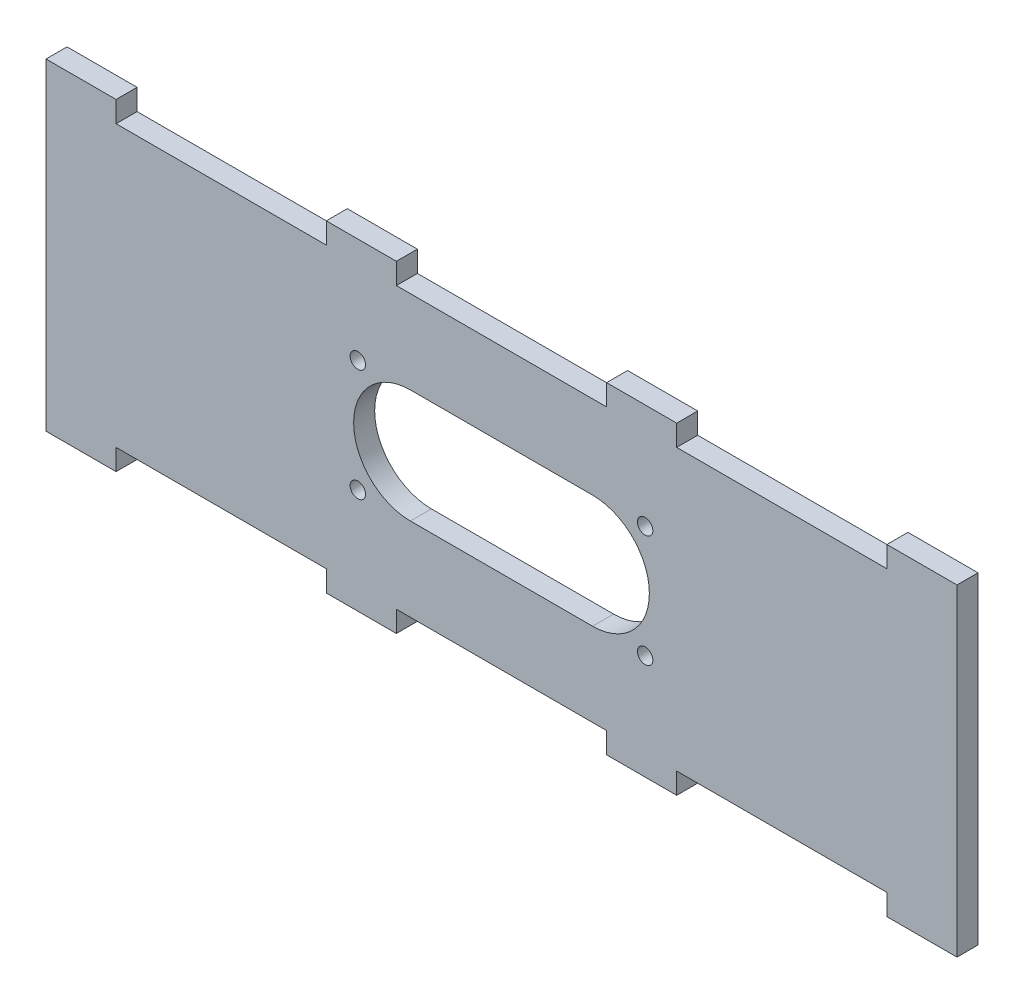
ISO-10303-21;
HEADER;
FILE_DESCRIPTION(('STEP AP214'),'2;1');
FILE_NAME('part.step','',(''),(''),'','','');
FILE_SCHEMA(('AUTOMOTIVE_DESIGN { 1 0 10303 214 1 1 1 1 }'));
ENDSEC;
DATA;
#1=APPLICATION_CONTEXT('core data for automotive mechanical design processes');
#2=APPLICATION_PROTOCOL_DEFINITION('international standard','automotive_design',2000,#1);
#3=PRODUCT_CONTEXT('',#1,'mechanical');
#4=PRODUCT('Part','Part','',(#3));
#5=PRODUCT_RELATED_PRODUCT_CATEGORY('part','',(#4));
#6=PRODUCT_DEFINITION_FORMATION('','',#4);
#7=PRODUCT_DEFINITION_CONTEXT('part definition',#1,'design');
#8=PRODUCT_DEFINITION('design','',#6,#7);
#9=PRODUCT_DEFINITION_SHAPE('','',#8);
#10=(LENGTH_UNIT() NAMED_UNIT(*) SI_UNIT(.MILLI.,.METRE.));
#11=(NAMED_UNIT(*) PLANE_ANGLE_UNIT() SI_UNIT($,.RADIAN.));
#12=(NAMED_UNIT(*) SI_UNIT($,.STERADIAN.) SOLID_ANGLE_UNIT());
#13=UNCERTAINTY_MEASURE_WITH_UNIT(LENGTH_MEASURE(1.E-05),#10,'distance_accuracy_value','');
#14=(GEOMETRIC_REPRESENTATION_CONTEXT(3) GLOBAL_UNCERTAINTY_ASSIGNED_CONTEXT((#13)) GLOBAL_UNIT_ASSIGNED_CONTEXT((#10,
#11,#12)) REPRESENTATION_CONTEXT('',''));
#15=CARTESIAN_POINT('',(0.,0.,0.));
#16=DIRECTION('',(0.,0.,1.));
#17=DIRECTION('',(1.,0.,0.));
#18=AXIS2_PLACEMENT_3D('',#15,#16,#17);
#19=CARTESIAN_POINT('',(-65.,0.,3.));
#20=DIRECTION('',(1.,0.,0.));
#21=DIRECTION('',(0.,0.,-1.));
#22=AXIS2_PLACEMENT_3D('',#19,#20,#21);
#23=PLANE('',#22);
#24=DIRECTION('',(0.,-1.,0.));
#25=VECTOR('',#24,1.);
#26=CARTESIAN_POINT('',(-65.,0.,0.));
#27=LINE('',#26,#25);
#28=CARTESIAN_POINT('',(-65.,23.,0.));
#29=VERTEX_POINT('',#28);
#30=CARTESIAN_POINT('',(-65.,-23.,0.));
#31=VERTEX_POINT('',#30);
#32=EDGE_CURVE('E307',#29,#31,#27,.T.);
#33=ORIENTED_EDGE('',*,*,#32,.T.);
#34=DIRECTION('',(0.,0.,-1.));
#35=VECTOR('',#34,1.);
#36=CARTESIAN_POINT('',(-65.,-23.,3.));
#37=LINE('',#36,#35);
#38=CARTESIAN_POINT('',(-65.,-23.,3.));
#39=VERTEX_POINT('',#38);
#40=EDGE_CURVE('E11',#39,#31,#37,.T.);
#41=ORIENTED_EDGE('',*,*,#40,.F.);
#42=DIRECTION('',(0.,-1.,0.));
#43=VECTOR('',#42,1.);
#44=CARTESIAN_POINT('',(-65.,0.,3.));
#45=LINE('',#44,#43);
#46=CARTESIAN_POINT('',(-65.,23.,3.));
#47=VERTEX_POINT('',#46);
#48=EDGE_CURVE('E311',#47,#39,#45,.T.);
#49=ORIENTED_EDGE('',*,*,#48,.F.);
#50=DIRECTION('',(0.,0.,-1.));
#51=VECTOR('',#50,1.);
#52=CARTESIAN_POINT('',(-65.,23.,3.));
#53=LINE('',#52,#51);
#54=EDGE_CURVE('E401',#47,#29,#53,.T.);
#55=ORIENTED_EDGE('',*,*,#54,.T.);
#56=EDGE_LOOP('',(#33,#41,#49,#55));
#57=FACE_BOUND('',#56,.T.);
#58=ADVANCED_FACE('F41',(#57),#23,.F.);
#59=CARTESIAN_POINT('',(0.,-23.,3.));
#60=DIRECTION('',(0.,1.,0.));
#61=DIRECTION('',(-1.,0.,0.));
#62=AXIS2_PLACEMENT_3D('',#59,#60,#61);
#63=PLANE('',#62);
#64=DIRECTION('',(1.,0.,0.));
#65=VECTOR('',#64,1.);
#66=CARTESIAN_POINT('',(0.,-23.,0.));
#67=LINE('',#66,#65);
#68=CARTESIAN_POINT('',(-55.,-23.,0.));
#69=VERTEX_POINT('',#68);
#70=EDGE_CURVE('E405',#31,#69,#67,.T.);
#71=ORIENTED_EDGE('',*,*,#70,.T.);
#72=DIRECTION('',(0.,0.,-1.));
#73=VECTOR('',#72,1.);
#74=CARTESIAN_POINT('',(-55.,-23.,3.));
#75=LINE('',#74,#73);
#76=CARTESIAN_POINT('',(-55.,-23.,3.));
#77=VERTEX_POINT('',#76);
#78=EDGE_CURVE('E49',#77,#69,#75,.T.);
#79=ORIENTED_EDGE('',*,*,#78,.F.);
#80=DIRECTION('',(1.,0.,0.));
#81=VECTOR('',#80,1.);
#82=CARTESIAN_POINT('',(0.,-23.,3.));
#83=LINE('',#82,#81);
#84=EDGE_CURVE('E315',#39,#77,#83,.T.);
#85=ORIENTED_EDGE('',*,*,#84,.F.);
#86=ORIENTED_EDGE('',*,*,#40,.T.);
#87=EDGE_LOOP('',(#71,#79,#85,#86));
#88=FACE_BOUND('',#87,.T.);
#89=ADVANCED_FACE('F585',(#88),#63,.F.);
#90=CARTESIAN_POINT('',(-55.,0.,3.));
#91=DIRECTION('',(1.,0.,0.));
#92=DIRECTION('',(0.,0.,-1.));
#93=AXIS2_PLACEMENT_3D('',#90,#91,#92);
#94=PLANE('',#93);
#95=DIRECTION('',(0.,-1.,0.));
#96=VECTOR('',#95,1.);
#97=CARTESIAN_POINT('',(-55.,0.,0.));
#98=LINE('',#97,#96);
#99=CARTESIAN_POINT('',(-55.,-20.,0.));
#100=VERTEX_POINT('',#99);
#101=EDGE_CURVE('E409',#100,#69,#98,.T.);
#102=ORIENTED_EDGE('',*,*,#101,.F.);
#103=DIRECTION('',(0.,0.,-1.));
#104=VECTOR('',#103,1.);
#105=CARTESIAN_POINT('',(-55.,-20.,3.));
#106=LINE('',#105,#104);
#107=CARTESIAN_POINT('',(-55.,-20.,3.));
#108=VERTEX_POINT('',#107);
#109=EDGE_CURVE('E576',#108,#100,#106,.T.);
#110=ORIENTED_EDGE('',*,*,#109,.F.);
#111=DIRECTION('',(0.,-1.,0.));
#112=VECTOR('',#111,1.);
#113=CARTESIAN_POINT('',(-55.,0.,3.));
#114=LINE('',#113,#112);
#115=EDGE_CURVE('E319',#108,#77,#114,.T.);
#116=ORIENTED_EDGE('',*,*,#115,.T.);
#117=ORIENTED_EDGE('',*,*,#78,.T.);
#118=EDGE_LOOP('',(#102,#110,#116,#117));
#119=FACE_BOUND('',#118,.T.);
#120=ADVANCED_FACE('F582',(#119),#94,.T.);
#121=CARTESIAN_POINT('',(0.,-20.,3.));
#122=DIRECTION('',(0.,1.,0.));
#123=DIRECTION('',(-1.,0.,0.));
#124=AXIS2_PLACEMENT_3D('',#121,#122,#123);
#125=PLANE('',#124);
#126=DIRECTION('',(1.,0.,0.));
#127=VECTOR('',#126,1.);
#128=CARTESIAN_POINT('',(0.,-20.,0.));
#129=LINE('',#128,#127);
#130=CARTESIAN_POINT('',(-25.,-20.,0.));
#131=VERTEX_POINT('',#130);
#132=EDGE_CURVE('E413',#100,#131,#129,.T.);
#133=ORIENTED_EDGE('',*,*,#132,.T.);
#134=DIRECTION('',(0.,0.,-1.));
#135=VECTOR('',#134,1.);
#136=CARTESIAN_POINT('',(-25.,-20.,3.));
#137=LINE('',#136,#135);
#138=CARTESIAN_POINT('',(-25.,-20.,3.));
#139=VERTEX_POINT('',#138);
#140=EDGE_CURVE('E572',#139,#131,#137,.T.);
#141=ORIENTED_EDGE('',*,*,#140,.F.);
#142=DIRECTION('',(1.,0.,0.));
#143=VECTOR('',#142,1.);
#144=CARTESIAN_POINT('',(0.,-20.,3.));
#145=LINE('',#144,#143);
#146=EDGE_CURVE('E323',#108,#139,#145,.T.);
#147=ORIENTED_EDGE('',*,*,#146,.F.);
#148=ORIENTED_EDGE('',*,*,#109,.T.);
#149=EDGE_LOOP('',(#133,#141,#147,#148));
#150=FACE_BOUND('',#149,.T.);
#151=ADVANCED_FACE('F594',(#150),#125,.F.);
#152=CARTESIAN_POINT('',(-24.9999999999993,8.38449680055438E-13,3.));
#153=DIRECTION('',(1.,0.,0.));
#154=DIRECTION('',(0.,1.,0.));
#155=AXIS2_PLACEMENT_3D('',#152,#153,#154);
#156=PLANE('',#155);
#157=DIRECTION('',(0.,-1.,0.));
#158=VECTOR('',#157,1.);
#159=CARTESIAN_POINT('',(-24.9999999999993,8.38449680055438E-13,0.));
#160=LINE('',#159,#158);
#161=CARTESIAN_POINT('',(-25.0000000000001,-23.,0.));
#162=VERTEX_POINT('',#161);
#163=EDGE_CURVE('E416',#131,#162,#160,.T.);
#164=ORIENTED_EDGE('',*,*,#163,.T.);
#165=DIRECTION('',(0.,0.,-1.));
#166=VECTOR('',#165,1.);
#167=CARTESIAN_POINT('',(-25.0000000000001,-23.,3.));
#168=LINE('',#167,#166);
#169=CARTESIAN_POINT('',(-25.0000000000001,-23.,3.));
#170=VERTEX_POINT('',#169);
#171=EDGE_CURVE('E568',#170,#162,#168,.T.);
#172=ORIENTED_EDGE('',*,*,#171,.F.);
#173=DIRECTION('',(0.,-1.,0.));
#174=VECTOR('',#173,1.);
#175=CARTESIAN_POINT('',(-24.9999999999993,8.38449680055438E-13,3.));
#176=LINE('',#175,#174);
#177=EDGE_CURVE('E326',#139,#170,#176,.T.);
#178=ORIENTED_EDGE('',*,*,#177,.F.);
#179=ORIENTED_EDGE('',*,*,#140,.T.);
#180=EDGE_LOOP('',(#164,#172,#178,#179));
#181=FACE_BOUND('',#180,.T.);
#182=ADVANCED_FACE('F598',(#181),#156,.F.);
#183=CARTESIAN_POINT('',(0.,-23.,3.));
#184=DIRECTION('',(0.,1.,0.));
#185=DIRECTION('',(0.,0.,1.));
#186=AXIS2_PLACEMENT_3D('',#183,#184,#185);
#187=PLANE('',#186);
#188=DIRECTION('',(1.,0.,0.));
#189=VECTOR('',#188,1.);
#190=CARTESIAN_POINT('',(0.,-23.,0.));
#191=LINE('',#190,#189);
#192=CARTESIAN_POINT('',(-15.0000000000001,-23.,0.));
#193=VERTEX_POINT('',#192);
#194=EDGE_CURVE('E421',#162,#193,#191,.T.);
#195=ORIENTED_EDGE('',*,*,#194,.T.);
#196=DIRECTION('',(0.,0.,-1.));
#197=VECTOR('',#196,1.);
#198=CARTESIAN_POINT('',(-15.0000000000001,-23.,3.));
#199=LINE('',#198,#197);
#200=CARTESIAN_POINT('',(-15.0000000000001,-23.,3.));
#201=VERTEX_POINT('',#200);
#202=EDGE_CURVE('E565',#201,#193,#199,.T.);
#203=ORIENTED_EDGE('',*,*,#202,.F.);
#204=DIRECTION('',(1.,0.,0.));
#205=VECTOR('',#204,1.);
#206=CARTESIAN_POINT('',(0.,-23.,3.));
#207=LINE('',#206,#205);
#208=EDGE_CURVE('E331',#170,#201,#207,.T.);
#209=ORIENTED_EDGE('',*,*,#208,.F.);
#210=ORIENTED_EDGE('',*,*,#171,.T.);
#211=EDGE_LOOP('',(#195,#203,#209,#210));
#212=FACE_BOUND('',#211,.T.);
#213=ADVANCED_FACE('F715',(#212),#187,.F.);
#214=CARTESIAN_POINT('',(-14.9999999999993,5.03069808033253E-13,3.));
#215=DIRECTION('',(1.,0.,0.));
#216=DIRECTION('',(0.,1.,0.));
#217=AXIS2_PLACEMENT_3D('',#214,#215,#216);
#218=PLANE('',#217);
#219=DIRECTION('',(0.,-1.,0.));
#220=VECTOR('',#219,1.);
#221=CARTESIAN_POINT('',(-14.9999999999993,5.03069808033253E-13,0.));
#222=LINE('',#221,#220);
#223=CARTESIAN_POINT('',(-15.,-20.,0.));
#224=VERTEX_POINT('',#223);
#225=EDGE_CURVE('E425',#224,#193,#222,.T.);
#226=ORIENTED_EDGE('',*,*,#225,.F.);
#227=DIRECTION('',(0.,0.,-1.));
#228=VECTOR('',#227,1.);
#229=CARTESIAN_POINT('',(-15.,-20.,3.));
#230=LINE('',#229,#228);
#231=CARTESIAN_POINT('',(-15.,-20.,3.));
#232=VERTEX_POINT('',#231);
#233=EDGE_CURVE('E562',#232,#224,#230,.T.);
#234=ORIENTED_EDGE('',*,*,#233,.F.);
#235=DIRECTION('',(0.,-1.,0.));
#236=VECTOR('',#235,1.);
#237=CARTESIAN_POINT('',(-14.9999999999993,5.03069808033253E-13,3.));
#238=LINE('',#237,#236);
#239=EDGE_CURVE('E334',#232,#201,#238,.T.);
#240=ORIENTED_EDGE('',*,*,#239,.T.);
#241=ORIENTED_EDGE('',*,*,#202,.T.);
#242=EDGE_LOOP('',(#226,#234,#240,#241));
#243=FACE_BOUND('',#242,.T.);
#244=ADVANCED_FACE('F718',(#243),#218,.T.);
#245=CARTESIAN_POINT('',(15.,-20.,0.));
#246=VERTEX_POINT('',#245);
#247=EDGE_CURVE('E418',#224,#246,#129,.T.);
#248=ORIENTED_EDGE('',*,*,#247,.T.);
#249=DIRECTION('',(0.,0.,-1.));
#250=VECTOR('',#249,1.);
#251=CARTESIAN_POINT('',(15.,-20.,3.));
#252=LINE('',#251,#250);
#253=CARTESIAN_POINT('',(15.,-20.,3.));
#254=VERTEX_POINT('',#253);
#255=EDGE_CURVE('E558',#254,#246,#252,.T.);
#256=ORIENTED_EDGE('',*,*,#255,.F.);
#257=EDGE_CURVE('E328',#232,#254,#145,.T.);
#258=ORIENTED_EDGE('',*,*,#257,.F.);
#259=ORIENTED_EDGE('',*,*,#233,.T.);
#260=EDGE_LOOP('',(#248,#256,#258,#259));
#261=FACE_BOUND('',#260,.T.);
#262=ADVANCED_FACE('F682',(#261),#125,.F.);
#263=CARTESIAN_POINT('',(14.9999999999994,4.77048955893603E-13,3.));
#264=DIRECTION('',(1.,0.,0.));
#265=DIRECTION('',(0.,1.,0.));
#266=AXIS2_PLACEMENT_3D('',#263,#264,#265);
#267=PLANE('',#266);
#268=DIRECTION('',(0.,-1.,0.));
#269=VECTOR('',#268,1.);
#270=CARTESIAN_POINT('',(14.9999999999994,4.77048955893603E-13,0.));
#271=LINE('',#270,#269);
#272=CARTESIAN_POINT('',(15.0000000000001,-23.,0.));
#273=VERTEX_POINT('',#272);
#274=EDGE_CURVE('E429',#246,#273,#271,.T.);
#275=ORIENTED_EDGE('',*,*,#274,.T.);
#276=DIRECTION('',(0.,0.,-1.));
#277=VECTOR('',#276,1.);
#278=CARTESIAN_POINT('',(15.0000000000001,-23.,3.));
#279=LINE('',#278,#277);
#280=CARTESIAN_POINT('',(15.0000000000001,-23.,3.));
#281=VERTEX_POINT('',#280);
#282=EDGE_CURVE('E555',#281,#273,#279,.T.);
#283=ORIENTED_EDGE('',*,*,#282,.F.);
#284=DIRECTION('',(0.,-1.,0.));
#285=VECTOR('',#284,1.);
#286=CARTESIAN_POINT('',(14.9999999999994,4.77048955893603E-13,3.));
#287=LINE('',#286,#285);
#288=EDGE_CURVE('E338',#254,#281,#287,.T.);
#289=ORIENTED_EDGE('',*,*,#288,.F.);
#290=ORIENTED_EDGE('',*,*,#255,.T.);
#291=EDGE_LOOP('',(#275,#283,#289,#290));
#292=FACE_BOUND('',#291,.T.);
#293=ADVANCED_FACE('F688',(#292),#267,.F.);
#294=CARTESIAN_POINT('',(0.,-23.,3.));
#295=DIRECTION('',(0.,-1.,0.));
#296=DIRECTION('',(1.,0.,0.));
#297=AXIS2_PLACEMENT_3D('',#294,#295,#296);
#298=PLANE('',#297);
#299=DIRECTION('',(-1.,0.,0.));
#300=VECTOR('',#299,1.);
#301=CARTESIAN_POINT('',(0.,-23.,0.));
#302=LINE('',#301,#300);
#303=CARTESIAN_POINT('',(25.0000000000001,-23.,0.));
#304=VERTEX_POINT('',#303);
#305=EDGE_CURVE('E433',#304,#273,#302,.T.);
#306=ORIENTED_EDGE('',*,*,#305,.F.);
#307=DIRECTION('',(0.,0.,-1.));
#308=VECTOR('',#307,1.);
#309=CARTESIAN_POINT('',(25.0000000000001,-23.,3.));
#310=LINE('',#309,#308);
#311=CARTESIAN_POINT('',(25.0000000000001,-23.,3.));
#312=VERTEX_POINT('',#311);
#313=EDGE_CURVE('E552',#312,#304,#310,.T.);
#314=ORIENTED_EDGE('',*,*,#313,.F.);
#315=DIRECTION('',(-1.,0.,0.));
#316=VECTOR('',#315,1.);
#317=CARTESIAN_POINT('',(0.,-23.,3.));
#318=LINE('',#317,#316);
#319=EDGE_CURVE('E341',#312,#281,#318,.T.);
#320=ORIENTED_EDGE('',*,*,#319,.T.);
#321=ORIENTED_EDGE('',*,*,#282,.T.);
#322=EDGE_LOOP('',(#306,#314,#320,#321));
#323=FACE_BOUND('',#322,.T.);
#324=ADVANCED_FACE('F692',(#323),#298,.T.);
#325=CARTESIAN_POINT('',(24.9999999999994,7.517135062566E-13,3.));
#326=DIRECTION('',(1.,0.,0.));
#327=DIRECTION('',(0.,1.,0.));
#328=AXIS2_PLACEMENT_3D('',#325,#326,#327);
#329=PLANE('',#328);
#330=DIRECTION('',(0.,-1.,0.));
#331=VECTOR('',#330,1.);
#332=CARTESIAN_POINT('',(24.9999999999994,7.517135062566E-13,0.));
#333=LINE('',#332,#331);
#334=CARTESIAN_POINT('',(25.,-20.,0.));
#335=VERTEX_POINT('',#334);
#336=EDGE_CURVE('E437',#335,#304,#333,.T.);
#337=ORIENTED_EDGE('',*,*,#336,.F.);
#338=DIRECTION('',(0.,0.,-1.));
#339=VECTOR('',#338,1.);
#340=CARTESIAN_POINT('',(25.,-20.,3.));
#341=LINE('',#340,#339);
#342=CARTESIAN_POINT('',(25.,-20.,3.));
#343=VERTEX_POINT('',#342);
#344=EDGE_CURVE('E549',#343,#335,#341,.T.);
#345=ORIENTED_EDGE('',*,*,#344,.F.);
#346=DIRECTION('',(0.,-1.,0.));
#347=VECTOR('',#346,1.);
#348=CARTESIAN_POINT('',(24.9999999999994,7.517135062566E-13,3.));
#349=LINE('',#348,#347);
#350=EDGE_CURVE('E345',#343,#312,#349,.T.);
#351=ORIENTED_EDGE('',*,*,#350,.T.);
#352=ORIENTED_EDGE('',*,*,#313,.T.);
#353=EDGE_LOOP('',(#337,#345,#351,#352));
#354=FACE_BOUND('',#353,.T.);
#355=ADVANCED_FACE('F695',(#354),#329,.T.);
#356=CARTESIAN_POINT('',(55.,-20.,0.));
#357=VERTEX_POINT('',#356);
#358=EDGE_CURVE('E417',#335,#357,#129,.T.);
#359=ORIENTED_EDGE('',*,*,#358,.T.);
#360=DIRECTION('',(0.,0.,-1.));
#361=VECTOR('',#360,1.);
#362=CARTESIAN_POINT('',(55.,-20.,3.));
#363=LINE('',#362,#361);
#364=CARTESIAN_POINT('',(55.,-20.,3.));
#365=VERTEX_POINT('',#364);
#366=EDGE_CURVE('E545',#365,#357,#363,.T.);
#367=ORIENTED_EDGE('',*,*,#366,.F.);
#368=EDGE_CURVE('E327',#343,#365,#145,.T.);
#369=ORIENTED_EDGE('',*,*,#368,.F.);
#370=ORIENTED_EDGE('',*,*,#344,.T.);
#371=EDGE_LOOP('',(#359,#367,#369,#370));
#372=FACE_BOUND('',#371,.T.);
#373=ADVANCED_FACE('F675',(#372),#125,.F.);
#374=CARTESIAN_POINT('',(55.0000000000002,-5.08852219619866E-13,3.));
#375=DIRECTION('',(1.,0.,0.));
#376=DIRECTION('',(0.,1.,0.));
#377=AXIS2_PLACEMENT_3D('',#374,#375,#376);
#378=PLANE('',#377);
#379=DIRECTION('',(0.,-1.,0.));
#380=VECTOR('',#379,1.);
#381=CARTESIAN_POINT('',(55.0000000000002,-5.08852219619866E-13,0.));
#382=LINE('',#381,#380);
#383=CARTESIAN_POINT('',(55.,-23.,0.));
#384=VERTEX_POINT('',#383);
#385=EDGE_CURVE('E441',#357,#384,#382,.T.);
#386=ORIENTED_EDGE('',*,*,#385,.T.);
#387=DIRECTION('',(0.,0.,-1.));
#388=VECTOR('',#387,1.);
#389=CARTESIAN_POINT('',(55.,-23.,3.));
#390=LINE('',#389,#388);
#391=CARTESIAN_POINT('',(55.,-23.,3.));
#392=VERTEX_POINT('',#391);
#393=EDGE_CURVE('E542',#392,#384,#390,.T.);
#394=ORIENTED_EDGE('',*,*,#393,.F.);
#395=DIRECTION('',(0.,-1.,0.));
#396=VECTOR('',#395,1.);
#397=CARTESIAN_POINT('',(55.0000000000002,-5.08852219619866E-13,3.));
#398=LINE('',#397,#396);
#399=EDGE_CURVE('E349',#365,#392,#398,.T.);
#400=ORIENTED_EDGE('',*,*,#399,.F.);
#401=ORIENTED_EDGE('',*,*,#366,.T.);
#402=EDGE_LOOP('',(#386,#394,#400,#401));
#403=FACE_BOUND('',#402,.T.);
#404=ADVANCED_FACE('F670',(#403),#378,.F.);
#405=CARTESIAN_POINT('',(0.,-23.,3.));
#406=DIRECTION('',(0.,-1.,0.));
#407=DIRECTION('',(0.,0.,-1.));
#408=AXIS2_PLACEMENT_3D('',#405,#406,#407);
#409=PLANE('',#408);
#410=DIRECTION('',(-1.,0.,0.));
#411=VECTOR('',#410,1.);
#412=CARTESIAN_POINT('',(0.,-23.,0.));
#413=LINE('',#412,#411);
#414=CARTESIAN_POINT('',(65.0000000000002,-23.,0.));
#415=VERTEX_POINT('',#414);
#416=EDGE_CURVE('E445',#415,#384,#413,.T.);
#417=ORIENTED_EDGE('',*,*,#416,.F.);
#418=DIRECTION('',(0.,0.,-1.));
#419=VECTOR('',#418,1.);
#420=CARTESIAN_POINT('',(65.0000000000002,-23.,3.));
#421=LINE('',#420,#419);
#422=CARTESIAN_POINT('',(65.0000000000002,-23.,3.));
#423=VERTEX_POINT('',#422);
#424=EDGE_CURVE('E539',#423,#415,#421,.T.);
#425=ORIENTED_EDGE('',*,*,#424,.F.);
#426=DIRECTION('',(-1.,0.,0.));
#427=VECTOR('',#426,1.);
#428=CARTESIAN_POINT('',(0.,-23.,3.));
#429=LINE('',#428,#427);
#430=EDGE_CURVE('E352',#423,#392,#429,.T.);
#431=ORIENTED_EDGE('',*,*,#430,.T.);
#432=ORIENTED_EDGE('',*,*,#393,.T.);
#433=EDGE_LOOP('',(#417,#425,#431,#432));
#434=FACE_BOUND('',#433,.T.);
#435=ADVANCED_FACE('F664',(#434),#409,.T.);
#436=CARTESIAN_POINT('',(65.,0.,3.));
#437=DIRECTION('',(1.,0.,0.));
#438=DIRECTION('',(0.,0.,-1.));
#439=AXIS2_PLACEMENT_3D('',#436,#437,#438);
#440=PLANE('',#439);
#441=DIRECTION('',(0.,-1.,0.));
#442=VECTOR('',#441,1.);
#443=CARTESIAN_POINT('',(65.,0.,0.));
#444=LINE('',#443,#442);
#445=CARTESIAN_POINT('',(65.0000000000002,23.,0.));
#446=VERTEX_POINT('',#445);
#447=EDGE_CURVE('E449',#446,#415,#444,.T.);
#448=ORIENTED_EDGE('',*,*,#447,.F.);
#449=DIRECTION('',(0.,0.,-1.));
#450=VECTOR('',#449,1.);
#451=CARTESIAN_POINT('',(65.0000000000002,23.,3.));
#452=LINE('',#451,#450);
#453=CARTESIAN_POINT('',(65.0000000000002,23.,3.));
#454=VERTEX_POINT('',#453);
#455=EDGE_CURVE('E536',#454,#446,#452,.T.);
#456=ORIENTED_EDGE('',*,*,#455,.F.);
#457=DIRECTION('',(0.,-1.,0.));
#458=VECTOR('',#457,1.);
#459=CARTESIAN_POINT('',(65.,0.,3.));
#460=LINE('',#459,#458);
#461=EDGE_CURVE('E356',#454,#423,#460,.T.);
#462=ORIENTED_EDGE('',*,*,#461,.T.);
#463=ORIENTED_EDGE('',*,*,#424,.T.);
#464=EDGE_LOOP('',(#448,#456,#462,#463));
#465=FACE_BOUND('',#464,.T.);
#466=ADVANCED_FACE('F658',(#465),#440,.T.);
#467=CARTESIAN_POINT('',(0.,23.,3.));
#468=DIRECTION('',(0.,-1.,0.));
#469=DIRECTION('',(0.,0.,-1.));
#470=AXIS2_PLACEMENT_3D('',#467,#468,#469);
#471=PLANE('',#470);
#472=DIRECTION('',(-1.,0.,0.));
#473=VECTOR('',#472,1.);
#474=CARTESIAN_POINT('',(0.,23.,0.));
#475=LINE('',#474,#473);
#476=CARTESIAN_POINT('',(55.,23.,0.));
#477=VERTEX_POINT('',#476);
#478=EDGE_CURVE('E453',#446,#477,#475,.T.);
#479=ORIENTED_EDGE('',*,*,#478,.T.);
#480=DIRECTION('',(0.,0.,-1.));
#481=VECTOR('',#480,1.);
#482=CARTESIAN_POINT('',(55.,23.,3.));
#483=LINE('',#482,#481);
#484=CARTESIAN_POINT('',(55.,23.,3.));
#485=VERTEX_POINT('',#484);
#486=EDGE_CURVE('E533',#485,#477,#483,.T.);
#487=ORIENTED_EDGE('',*,*,#486,.F.);
#488=DIRECTION('',(-1.,0.,0.));
#489=VECTOR('',#488,1.);
#490=CARTESIAN_POINT('',(0.,23.,3.));
#491=LINE('',#490,#489);
#492=EDGE_CURVE('E360',#454,#485,#491,.T.);
#493=ORIENTED_EDGE('',*,*,#492,.F.);
#494=ORIENTED_EDGE('',*,*,#455,.T.);
#495=EDGE_LOOP('',(#479,#487,#493,#494));
#496=FACE_BOUND('',#495,.T.);
#497=ADVANCED_FACE('F800',(#496),#471,.F.);
#498=CARTESIAN_POINT('',(55.0000000000002,5.08852219619866E-13,3.));
#499=DIRECTION('',(-1.,0.,0.));
#500=DIRECTION('',(0.,-1.,0.));
#501=AXIS2_PLACEMENT_3D('',#498,#499,#500);
#502=PLANE('',#501);
#503=DIRECTION('',(0.,1.,0.));
#504=VECTOR('',#503,1.);
#505=CARTESIAN_POINT('',(55.0000000000002,5.08852219619866E-13,0.));
#506=LINE('',#505,#504);
#507=CARTESIAN_POINT('',(55.,20.,0.));
#508=VERTEX_POINT('',#507);
#509=EDGE_CURVE('E457',#508,#477,#506,.T.);
#510=ORIENTED_EDGE('',*,*,#509,.F.);
#511=DIRECTION('',(0.,0.,-1.));
#512=VECTOR('',#511,1.);
#513=CARTESIAN_POINT('',(55.,20.,3.));
#514=LINE('',#513,#512);
#515=CARTESIAN_POINT('',(55.,20.,3.));
#516=VERTEX_POINT('',#515);
#517=EDGE_CURVE('E530',#516,#508,#514,.T.);
#518=ORIENTED_EDGE('',*,*,#517,.F.);
#519=DIRECTION('',(0.,1.,0.));
#520=VECTOR('',#519,1.);
#521=CARTESIAN_POINT('',(55.0000000000002,5.08852219619866E-13,3.));
#522=LINE('',#521,#520);
#523=EDGE_CURVE('E363',#516,#485,#522,.T.);
#524=ORIENTED_EDGE('',*,*,#523,.T.);
#525=ORIENTED_EDGE('',*,*,#486,.T.);
#526=EDGE_LOOP('',(#510,#518,#524,#525));
#527=FACE_BOUND('',#526,.T.);
#528=ADVANCED_FACE('F652',(#527),#502,.T.);
#529=CARTESIAN_POINT('',(0.,20.,3.));
#530=DIRECTION('',(0.,1.,0.));
#531=DIRECTION('',(-1.,0.,0.));
#532=AXIS2_PLACEMENT_3D('',#529,#530,#531);
#533=PLANE('',#532);
#534=DIRECTION('',(1.,0.,0.));
#535=VECTOR('',#534,1.);
#536=CARTESIAN_POINT('',(0.,20.,0.));
#537=LINE('',#536,#535);
#538=CARTESIAN_POINT('',(25.,20.,0.));
#539=VERTEX_POINT('',#538);
#540=EDGE_CURVE('E461',#539,#508,#537,.T.);
#541=ORIENTED_EDGE('',*,*,#540,.F.);
#542=DIRECTION('',(0.,0.,-1.));
#543=VECTOR('',#542,1.);
#544=CARTESIAN_POINT('',(25.,20.,3.));
#545=LINE('',#544,#543);
#546=CARTESIAN_POINT('',(25.,20.,3.));
#547=VERTEX_POINT('',#546);
#548=EDGE_CURVE('E527',#547,#539,#545,.T.);
#549=ORIENTED_EDGE('',*,*,#548,.F.);
#550=DIRECTION('',(1.,0.,0.));
#551=VECTOR('',#550,1.);
#552=CARTESIAN_POINT('',(0.,20.,3.));
#553=LINE('',#552,#551);
#554=EDGE_CURVE('E367',#547,#516,#553,.T.);
#555=ORIENTED_EDGE('',*,*,#554,.T.);
#556=ORIENTED_EDGE('',*,*,#517,.T.);
#557=EDGE_LOOP('',(#541,#549,#555,#556));
#558=FACE_BOUND('',#557,.T.);
#559=ADVANCED_FACE('F646',(#558),#533,.T.);
#560=CARTESIAN_POINT('',(24.9999999999994,-7.517135062566E-13,3.));
#561=DIRECTION('',(-1.,0.,0.));
#562=DIRECTION('',(0.,-1.,0.));
#563=AXIS2_PLACEMENT_3D('',#560,#561,#562);
#564=PLANE('',#563);
#565=DIRECTION('',(0.,1.,0.));
#566=VECTOR('',#565,1.);
#567=CARTESIAN_POINT('',(24.9999999999994,-7.517135062566E-13,0.));
#568=LINE('',#567,#566);
#569=CARTESIAN_POINT('',(25.0000000000001,23.,0.));
#570=VERTEX_POINT('',#569);
#571=EDGE_CURVE('E465',#539,#570,#568,.T.);
#572=ORIENTED_EDGE('',*,*,#571,.T.);
#573=DIRECTION('',(0.,0.,-1.));
#574=VECTOR('',#573,1.);
#575=CARTESIAN_POINT('',(25.0000000000001,23.,3.));
#576=LINE('',#575,#574);
#577=CARTESIAN_POINT('',(25.0000000000001,23.,3.));
#578=VERTEX_POINT('',#577);
#579=EDGE_CURVE('E523',#578,#570,#576,.T.);
#580=ORIENTED_EDGE('',*,*,#579,.F.);
#581=DIRECTION('',(0.,1.,0.));
#582=VECTOR('',#581,1.);
#583=CARTESIAN_POINT('',(24.9999999999994,-7.517135062566E-13,3.));
#584=LINE('',#583,#582);
#585=EDGE_CURVE('E371',#547,#578,#584,.T.);
#586=ORIENTED_EDGE('',*,*,#585,.F.);
#587=ORIENTED_EDGE('',*,*,#548,.T.);
#588=EDGE_LOOP('',(#572,#580,#586,#587));
#589=FACE_BOUND('',#588,.T.);
#590=ADVANCED_FACE('F827',(#589),#564,.F.);
#591=CARTESIAN_POINT('',(0.,23.,3.));
#592=DIRECTION('',(0.,-1.,0.));
#593=DIRECTION('',(1.,0.,0.));
#594=AXIS2_PLACEMENT_3D('',#591,#592,#593);
#595=PLANE('',#594);
#596=DIRECTION('',(-1.,0.,0.));
#597=VECTOR('',#596,1.);
#598=CARTESIAN_POINT('',(0.,23.,0.));
#599=LINE('',#598,#597);
#600=CARTESIAN_POINT('',(15.0000000000001,23.,0.));
#601=VERTEX_POINT('',#600);
#602=EDGE_CURVE('E470',#570,#601,#599,.T.);
#603=ORIENTED_EDGE('',*,*,#602,.T.);
#604=DIRECTION('',(0.,0.,-1.));
#605=VECTOR('',#604,1.);
#606=CARTESIAN_POINT('',(15.0000000000001,23.,3.));
#607=LINE('',#606,#605);
#608=CARTESIAN_POINT('',(15.0000000000001,23.,3.));
#609=VERTEX_POINT('',#608);
#610=EDGE_CURVE('E520',#609,#601,#607,.T.);
#611=ORIENTED_EDGE('',*,*,#610,.F.);
#612=DIRECTION('',(-1.,0.,0.));
#613=VECTOR('',#612,1.);
#614=CARTESIAN_POINT('',(0.,23.,3.));
#615=LINE('',#614,#613);
#616=EDGE_CURVE('E376',#578,#609,#615,.T.);
#617=ORIENTED_EDGE('',*,*,#616,.F.);
#618=ORIENTED_EDGE('',*,*,#579,.T.);
#619=EDGE_LOOP('',(#603,#611,#617,#618));
#620=FACE_BOUND('',#619,.T.);
#621=ADVANCED_FACE('F640',(#620),#595,.F.);
#622=CARTESIAN_POINT('',(14.9999999999994,-4.77048955893603E-13,3.));
#623=DIRECTION('',(-1.,0.,0.));
#624=DIRECTION('',(0.,-1.,0.));
#625=AXIS2_PLACEMENT_3D('',#622,#623,#624);
#626=PLANE('',#625);
#627=DIRECTION('',(0.,1.,0.));
#628=VECTOR('',#627,1.);
#629=CARTESIAN_POINT('',(14.9999999999994,-4.77048955893603E-13,0.));
#630=LINE('',#629,#628);
#631=CARTESIAN_POINT('',(15.,20.,0.));
#632=VERTEX_POINT('',#631);
#633=EDGE_CURVE('E474',#632,#601,#630,.T.);
#634=ORIENTED_EDGE('',*,*,#633,.F.);
#635=DIRECTION('',(0.,0.,-1.));
#636=VECTOR('',#635,1.);
#637=CARTESIAN_POINT('',(15.,20.,3.));
#638=LINE('',#637,#636);
#639=CARTESIAN_POINT('',(15.,20.,3.));
#640=VERTEX_POINT('',#639);
#641=EDGE_CURVE('E517',#640,#632,#638,.T.);
#642=ORIENTED_EDGE('',*,*,#641,.F.);
#643=DIRECTION('',(0.,1.,0.));
#644=VECTOR('',#643,1.);
#645=CARTESIAN_POINT('',(14.9999999999994,-4.77048955893603E-13,3.));
#646=LINE('',#645,#644);
#647=EDGE_CURVE('E379',#640,#609,#646,.T.);
#648=ORIENTED_EDGE('',*,*,#647,.T.);
#649=ORIENTED_EDGE('',*,*,#610,.T.);
#650=EDGE_LOOP('',(#634,#642,#648,#649));
#651=FACE_BOUND('',#650,.T.);
#652=ADVANCED_FACE('F636',(#651),#626,.T.);
#653=CARTESIAN_POINT('',(-15.,20.,0.));
#654=VERTEX_POINT('',#653);
#655=EDGE_CURVE('E467',#654,#632,#537,.T.);
#656=ORIENTED_EDGE('',*,*,#655,.F.);
#657=DIRECTION('',(0.,0.,-1.));
#658=VECTOR('',#657,1.);
#659=CARTESIAN_POINT('',(-15.,20.,3.));
#660=LINE('',#659,#658);
#661=CARTESIAN_POINT('',(-15.,20.,3.));
#662=VERTEX_POINT('',#661);
#663=EDGE_CURVE('E514',#662,#654,#660,.T.);
#664=ORIENTED_EDGE('',*,*,#663,.F.);
#665=EDGE_CURVE('E373',#662,#640,#553,.T.);
#666=ORIENTED_EDGE('',*,*,#665,.T.);
#667=ORIENTED_EDGE('',*,*,#641,.T.);
#668=EDGE_LOOP('',(#656,#664,#666,#667));
#669=FACE_BOUND('',#668,.T.);
#670=ADVANCED_FACE('F630',(#669),#533,.T.);
#671=CARTESIAN_POINT('',(-14.9999999999993,-5.03069808033253E-13,3.));
#672=DIRECTION('',(-1.,0.,0.));
#673=DIRECTION('',(0.,-1.,0.));
#674=AXIS2_PLACEMENT_3D('',#671,#672,#673);
#675=PLANE('',#674);
#676=DIRECTION('',(0.,1.,0.));
#677=VECTOR('',#676,1.);
#678=CARTESIAN_POINT('',(-14.9999999999993,-5.03069808033253E-13,0.));
#679=LINE('',#678,#677);
#680=CARTESIAN_POINT('',(-15.0000000000001,23.,0.));
#681=VERTEX_POINT('',#680);
#682=EDGE_CURVE('E478',#654,#681,#679,.T.);
#683=ORIENTED_EDGE('',*,*,#682,.T.);
#684=DIRECTION('',(0.,0.,-1.));
#685=VECTOR('',#684,1.);
#686=CARTESIAN_POINT('',(-15.0000000000001,23.,3.));
#687=LINE('',#686,#685);
#688=CARTESIAN_POINT('',(-15.0000000000001,23.,3.));
#689=VERTEX_POINT('',#688);
#690=EDGE_CURVE('E511',#689,#681,#687,.T.);
#691=ORIENTED_EDGE('',*,*,#690,.F.);
#692=DIRECTION('',(0.,1.,0.));
#693=VECTOR('',#692,1.);
#694=CARTESIAN_POINT('',(-14.9999999999993,-5.03069808033253E-13,3.));
#695=LINE('',#694,#693);
#696=EDGE_CURVE('E383',#662,#689,#695,.T.);
#697=ORIENTED_EDGE('',*,*,#696,.F.);
#698=ORIENTED_EDGE('',*,*,#663,.T.);
#699=EDGE_LOOP('',(#683,#691,#697,#698));
#700=FACE_BOUND('',#699,.T.);
#701=ADVANCED_FACE('F862',(#700),#675,.F.);
#702=CARTESIAN_POINT('',(0.,23.,3.));
#703=DIRECTION('',(0.,1.,0.));
#704=DIRECTION('',(0.,0.,1.));
#705=AXIS2_PLACEMENT_3D('',#702,#703,#704);
#706=PLANE('',#705);
#707=DIRECTION('',(1.,0.,0.));
#708=VECTOR('',#707,1.);
#709=CARTESIAN_POINT('',(0.,23.,0.));
#710=LINE('',#709,#708);
#711=CARTESIAN_POINT('',(-25.0000000000001,23.,0.));
#712=VERTEX_POINT('',#711);
#713=EDGE_CURVE('E482',#712,#681,#710,.T.);
#714=ORIENTED_EDGE('',*,*,#713,.F.);
#715=DIRECTION('',(0.,0.,-1.));
#716=VECTOR('',#715,1.);
#717=CARTESIAN_POINT('',(-25.0000000000001,23.,3.));
#718=LINE('',#717,#716);
#719=CARTESIAN_POINT('',(-25.0000000000001,23.,3.));
#720=VERTEX_POINT('',#719);
#721=EDGE_CURVE('E508',#720,#712,#718,.T.);
#722=ORIENTED_EDGE('',*,*,#721,.F.);
#723=DIRECTION('',(1.,0.,0.));
#724=VECTOR('',#723,1.);
#725=CARTESIAN_POINT('',(0.,23.,3.));
#726=LINE('',#725,#724);
#727=EDGE_CURVE('E386',#720,#689,#726,.T.);
#728=ORIENTED_EDGE('',*,*,#727,.T.);
#729=ORIENTED_EDGE('',*,*,#690,.T.);
#730=EDGE_LOOP('',(#714,#722,#728,#729));
#731=FACE_BOUND('',#730,.T.);
#732=ADVANCED_FACE('F871',(#731),#706,.T.);
#733=CARTESIAN_POINT('',(-24.9999999999993,-8.38449680055438E-13,3.));
#734=DIRECTION('',(-1.,0.,0.));
#735=DIRECTION('',(0.,-1.,0.));
#736=AXIS2_PLACEMENT_3D('',#733,#734,#735);
#737=PLANE('',#736);
#738=DIRECTION('',(0.,1.,0.));
#739=VECTOR('',#738,1.);
#740=CARTESIAN_POINT('',(-24.9999999999993,-8.38449680055438E-13,0.));
#741=LINE('',#740,#739);
#742=CARTESIAN_POINT('',(-25.,20.,0.));
#743=VERTEX_POINT('',#742);
#744=EDGE_CURVE('E486',#743,#712,#741,.T.);
#745=ORIENTED_EDGE('',*,*,#744,.F.);
#746=DIRECTION('',(0.,0.,-1.));
#747=VECTOR('',#746,1.);
#748=CARTESIAN_POINT('',(-25.,20.,3.));
#749=LINE('',#748,#747);
#750=CARTESIAN_POINT('',(-25.,20.,3.));
#751=VERTEX_POINT('',#750);
#752=EDGE_CURVE('E505',#751,#743,#749,.T.);
#753=ORIENTED_EDGE('',*,*,#752,.F.);
#754=DIRECTION('',(0.,1.,0.));
#755=VECTOR('',#754,1.);
#756=CARTESIAN_POINT('',(-24.9999999999993,-8.38449680055438E-13,3.));
#757=LINE('',#756,#755);
#758=EDGE_CURVE('E390',#751,#720,#757,.T.);
#759=ORIENTED_EDGE('',*,*,#758,.T.);
#760=ORIENTED_EDGE('',*,*,#721,.T.);
#761=EDGE_LOOP('',(#745,#753,#759,#760));
#762=FACE_BOUND('',#761,.T.);
#763=ADVANCED_FACE('F881',(#762),#737,.T.);
#764=CARTESIAN_POINT('',(-55.,20.,0.));
#765=VERTEX_POINT('',#764);
#766=EDGE_CURVE('E466',#765,#743,#537,.T.);
#767=ORIENTED_EDGE('',*,*,#766,.F.);
#768=DIRECTION('',(0.,0.,-1.));
#769=VECTOR('',#768,1.);
#770=CARTESIAN_POINT('',(-55.,20.,3.));
#771=LINE('',#770,#769);
#772=CARTESIAN_POINT('',(-55.,20.,3.));
#773=VERTEX_POINT('',#772);
#774=EDGE_CURVE('E502',#773,#765,#771,.T.);
#775=ORIENTED_EDGE('',*,*,#774,.F.);
#776=EDGE_CURVE('E372',#773,#751,#553,.T.);
#777=ORIENTED_EDGE('',*,*,#776,.T.);
#778=ORIENTED_EDGE('',*,*,#752,.T.);
#779=EDGE_LOOP('',(#767,#775,#777,#778));
#780=FACE_BOUND('',#779,.T.);
#781=ADVANCED_FACE('F619',(#780),#533,.T.);
#782=CARTESIAN_POINT('',(-55.,0.,3.));
#783=DIRECTION('',(-1.,0.,0.));
#784=DIRECTION('',(0.,0.,1.));
#785=AXIS2_PLACEMENT_3D('',#782,#783,#784);
#786=PLANE('',#785);
#787=DIRECTION('',(0.,1.,0.));
#788=VECTOR('',#787,1.);
#789=CARTESIAN_POINT('',(-55.,0.,0.));
#790=LINE('',#789,#788);
#791=CARTESIAN_POINT('',(-55.,23.,0.));
#792=VERTEX_POINT('',#791);
#793=EDGE_CURVE('E490',#765,#792,#790,.T.);
#794=ORIENTED_EDGE('',*,*,#793,.T.);
#795=DIRECTION('',(0.,0.,-1.));
#796=VECTOR('',#795,1.);
#797=CARTESIAN_POINT('',(-55.,23.,3.));
#798=LINE('',#797,#796);
#799=CARTESIAN_POINT('',(-55.,23.,3.));
#800=VERTEX_POINT('',#799);
#801=EDGE_CURVE('E499',#800,#792,#798,.T.);
#802=ORIENTED_EDGE('',*,*,#801,.F.);
#803=DIRECTION('',(0.,1.,0.));
#804=VECTOR('',#803,1.);
#805=CARTESIAN_POINT('',(-55.,0.,3.));
#806=LINE('',#805,#804);
#807=EDGE_CURVE('E394',#773,#800,#806,.T.);
#808=ORIENTED_EDGE('',*,*,#807,.F.);
#809=ORIENTED_EDGE('',*,*,#774,.T.);
#810=EDGE_LOOP('',(#794,#802,#808,#809));
#811=FACE_BOUND('',#810,.T.);
#812=ADVANCED_FACE('F615',(#811),#786,.F.);
#813=CARTESIAN_POINT('',(0.,23.,3.));
#814=DIRECTION('',(0.,1.,0.));
#815=DIRECTION('',(-1.,0.,0.));
#816=AXIS2_PLACEMENT_3D('',#813,#814,#815);
#817=PLANE('',#816);
#818=DIRECTION('',(1.,0.,0.));
#819=VECTOR('',#818,1.);
#820=CARTESIAN_POINT('',(0.,23.,0.));
#821=LINE('',#820,#819);
#822=EDGE_CURVE('E316',#29,#792,#821,.T.);
#823=ORIENTED_EDGE('',*,*,#822,.F.);
#824=ORIENTED_EDGE('',*,*,#54,.F.);
#825=DIRECTION('',(1.,0.,0.));
#826=VECTOR('',#825,1.);
#827=CARTESIAN_POINT('',(0.,23.,3.));
#828=LINE('',#827,#826);
#829=EDGE_CURVE('E397',#47,#800,#828,.T.);
#830=ORIENTED_EDGE('',*,*,#829,.T.);
#831=ORIENTED_EDGE('',*,*,#801,.T.);
#832=EDGE_LOOP('',(#823,#824,#830,#831));
#833=FACE_BOUND('',#832,.T.);
#834=ADVANCED_FACE('F611',(#833),#817,.T.);
#835=CARTESIAN_POINT('',(0.,0.,3.));
#836=DIRECTION('',(0.,0.,1.));
#837=DIRECTION('',(1.,0.,0.));
#838=AXIS2_PLACEMENT_3D('',#835,#836,#837);
#839=PLANE('',#838);
#840=CARTESIAN_POINT('',(-20.5,-8.,3.));
#841=DIRECTION('',(0.,0.,1.));
#842=DIRECTION('',(1.,0.,0.));
#843=AXIS2_PLACEMENT_3D('',#840,#841,#842);
#844=CIRCLE('',#843,1.1);
#845=CARTESIAN_POINT('',(-19.4,-8.,3.));
#846=VERTEX_POINT('',#845);
#847=EDGE_CURVE('E278',#846,#846,#844,.T.);
#848=ORIENTED_EDGE('',*,*,#847,.F.);
#849=EDGE_LOOP('',(#848));
#850=FACE_BOUND('',#849,.T.);
#851=CARTESIAN_POINT('',(-13.,0.,3.));
#852=DIRECTION('',(0.,0.,1.));
#853=DIRECTION('',(1.,0.,0.));
#854=AXIS2_PLACEMENT_3D('',#851,#852,#853);
#855=CIRCLE('',#854,8.1);
#856=CARTESIAN_POINT('',(-13.,8.1,3.));
#857=VERTEX_POINT('',#856);
#858=CARTESIAN_POINT('',(-13.,-8.1,3.));
#859=VERTEX_POINT('',#858);
#860=EDGE_CURVE('E56',#857,#859,#855,.T.);
#861=ORIENTED_EDGE('',*,*,#860,.F.);
#862=DIRECTION('',(-1.,0.,0.));
#863=VECTOR('',#862,1.);
#864=CARTESIAN_POINT('',(-13.,8.1,3.));
#865=LINE('',#864,#863);
#866=CARTESIAN_POINT('',(13.,8.1,3.));
#867=VERTEX_POINT('',#866);
#868=EDGE_CURVE('E271',#867,#857,#865,.T.);
#869=ORIENTED_EDGE('',*,*,#868,.F.);
#870=CARTESIAN_POINT('',(13.,0.,3.));
#871=DIRECTION('',(0.,0.,1.));
#872=DIRECTION('',(1.,0.,0.));
#873=AXIS2_PLACEMENT_3D('',#870,#871,#872);
#874=CIRCLE('',#873,8.1);
#875=CARTESIAN_POINT('',(13.,-8.1,3.));
#876=VERTEX_POINT('',#875);
#877=EDGE_CURVE('E275',#876,#867,#874,.T.);
#878=ORIENTED_EDGE('',*,*,#877,.F.);
#879=DIRECTION('',(1.,0.,0.));
#880=VECTOR('',#879,1.);
#881=CARTESIAN_POINT('',(-13.,-8.1,3.));
#882=LINE('',#881,#880);
#883=EDGE_CURVE('E287',#859,#876,#882,.T.);
#884=ORIENTED_EDGE('',*,*,#883,.F.);
#885=EDGE_LOOP('',(#861,#869,#878,#884));
#886=FACE_BOUND('',#885,.T.);
#887=CARTESIAN_POINT('',(20.5,8.,3.));
#888=DIRECTION('',(0.,0.,1.));
#889=DIRECTION('',(1.,0.,0.));
#890=AXIS2_PLACEMENT_3D('',#887,#888,#889);
#891=CIRCLE('',#890,1.1);
#892=CARTESIAN_POINT('',(21.6,8.,3.));
#893=VERTEX_POINT('',#892);
#894=EDGE_CURVE('E1027',#893,#893,#891,.T.);
#895=ORIENTED_EDGE('',*,*,#894,.F.);
#896=EDGE_LOOP('',(#895));
#897=FACE_BOUND('',#896,.T.);
#898=CARTESIAN_POINT('',(20.5,-8.,3.));
#899=DIRECTION('',(0.,0.,1.));
#900=DIRECTION('',(1.,0.,0.));
#901=AXIS2_PLACEMENT_3D('',#898,#899,#900);
#902=CIRCLE('',#901,1.1);
#903=CARTESIAN_POINT('',(21.6,-8.,3.));
#904=VERTEX_POINT('',#903);
#905=EDGE_CURVE('E1038',#904,#904,#902,.T.);
#906=ORIENTED_EDGE('',*,*,#905,.F.);
#907=EDGE_LOOP('',(#906));
#908=FACE_BOUND('',#907,.T.);
#909=CARTESIAN_POINT('',(-20.5,8.,3.));
#910=DIRECTION('',(0.,0.,1.));
#911=DIRECTION('',(1.,0.,0.));
#912=AXIS2_PLACEMENT_3D('',#909,#910,#911);
#913=CIRCLE('',#912,1.1);
#914=CARTESIAN_POINT('',(-19.4,8.,3.));
#915=VERTEX_POINT('',#914);
#916=EDGE_CURVE('E297',#915,#915,#913,.T.);
#917=ORIENTED_EDGE('',*,*,#916,.F.);
#918=EDGE_LOOP('',(#917));
#919=FACE_BOUND('',#918,.T.);
#920=ORIENTED_EDGE('',*,*,#48,.T.);
#921=ORIENTED_EDGE('',*,*,#84,.T.);
#922=ORIENTED_EDGE('',*,*,#115,.F.);
#923=ORIENTED_EDGE('',*,*,#146,.T.);
#924=ORIENTED_EDGE('',*,*,#177,.T.);
#925=ORIENTED_EDGE('',*,*,#208,.T.);
#926=ORIENTED_EDGE('',*,*,#239,.F.);
#927=ORIENTED_EDGE('',*,*,#257,.T.);
#928=ORIENTED_EDGE('',*,*,#288,.T.);
#929=ORIENTED_EDGE('',*,*,#319,.F.);
#930=ORIENTED_EDGE('',*,*,#350,.F.);
#931=ORIENTED_EDGE('',*,*,#368,.T.);
#932=ORIENTED_EDGE('',*,*,#399,.T.);
#933=ORIENTED_EDGE('',*,*,#430,.F.);
#934=ORIENTED_EDGE('',*,*,#461,.F.);
#935=ORIENTED_EDGE('',*,*,#492,.T.);
#936=ORIENTED_EDGE('',*,*,#523,.F.);
#937=ORIENTED_EDGE('',*,*,#554,.F.);
#938=ORIENTED_EDGE('',*,*,#585,.T.);
#939=ORIENTED_EDGE('',*,*,#616,.T.);
#940=ORIENTED_EDGE('',*,*,#647,.F.);
#941=ORIENTED_EDGE('',*,*,#665,.F.);
#942=ORIENTED_EDGE('',*,*,#696,.T.);
#943=ORIENTED_EDGE('',*,*,#727,.F.);
#944=ORIENTED_EDGE('',*,*,#758,.F.);
#945=ORIENTED_EDGE('',*,*,#776,.F.);
#946=ORIENTED_EDGE('',*,*,#807,.T.);
#947=ORIENTED_EDGE('',*,*,#829,.F.);
#948=EDGE_LOOP('',(#920,#921,#922,#923,#924,#925,#926,#927,#928,#929,#930,#931,#932,#933,#934,
#935,#936,#937,#938,#939,#940,#941,#942,#943,#944,#945,#946,#947));
#949=FACE_BOUND('',#948,.T.);
#950=ADVANCED_FACE('F602',(#850,#886,#897,#908,#919,#949),#839,.T.);
#951=CARTESIAN_POINT('',(0.,0.,0.));
#952=DIRECTION('',(0.,0.,1.));
#953=DIRECTION('',(1.,0.,0.));
#954=AXIS2_PLACEMENT_3D('',#951,#952,#953);
#955=PLANE('',#954);
#956=CARTESIAN_POINT('',(-20.5,-8.,0.));
#957=DIRECTION('',(0.,0.,1.));
#958=DIRECTION('',(1.,0.,0.));
#959=AXIS2_PLACEMENT_3D('',#956,#957,#958);
#960=CIRCLE('',#959,1.1);
#961=CARTESIAN_POINT('',(-19.4,-8.,0.));
#962=VERTEX_POINT('',#961);
#963=EDGE_CURVE('E288',#962,#962,#960,.T.);
#964=ORIENTED_EDGE('',*,*,#963,.T.);
#965=EDGE_LOOP('',(#964));
#966=FACE_BOUND('',#965,.T.);
#967=DIRECTION('',(-1.,0.,0.));
#968=VECTOR('',#967,1.);
#969=CARTESIAN_POINT('',(-13.,8.1,0.));
#970=LINE('',#969,#968);
#971=CARTESIAN_POINT('',(13.,8.1,0.));
#972=VERTEX_POINT('',#971);
#973=CARTESIAN_POINT('',(-13.,8.1,0.));
#974=VERTEX_POINT('',#973);
#975=EDGE_CURVE('E259',#972,#974,#970,.T.);
#976=ORIENTED_EDGE('',*,*,#975,.T.);
#977=CARTESIAN_POINT('',(-13.,0.,0.));
#978=DIRECTION('',(0.,0.,1.));
#979=DIRECTION('',(1.,0.,0.));
#980=AXIS2_PLACEMENT_3D('',#977,#978,#979);
#981=CIRCLE('',#980,8.1);
#982=CARTESIAN_POINT('',(-13.,-8.1,0.));
#983=VERTEX_POINT('',#982);
#984=EDGE_CURVE('E252',#974,#983,#981,.T.);
#985=ORIENTED_EDGE('',*,*,#984,.T.);
#986=DIRECTION('',(1.,0.,0.));
#987=VECTOR('',#986,1.);
#988=CARTESIAN_POINT('',(-13.,-8.1,0.));
#989=LINE('',#988,#987);
#990=CARTESIAN_POINT('',(13.,-8.1,0.));
#991=VERTEX_POINT('',#990);
#992=EDGE_CURVE('E262',#983,#991,#989,.T.);
#993=ORIENTED_EDGE('',*,*,#992,.T.);
#994=CARTESIAN_POINT('',(13.,0.,0.));
#995=DIRECTION('',(0.,0.,1.));
#996=DIRECTION('',(1.,0.,0.));
#997=AXIS2_PLACEMENT_3D('',#994,#995,#996);
#998=CIRCLE('',#997,8.1);
#999=EDGE_CURVE('E64',#991,#972,#998,.T.);
#1000=ORIENTED_EDGE('',*,*,#999,.T.);
#1001=EDGE_LOOP('',(#976,#985,#993,#1000));
#1002=FACE_BOUND('',#1001,.T.);
#1003=CARTESIAN_POINT('',(20.5,8.,0.));
#1004=DIRECTION('',(0.,0.,1.));
#1005=DIRECTION('',(1.,0.,0.));
#1006=AXIS2_PLACEMENT_3D('',#1003,#1004,#1005);
#1007=CIRCLE('',#1006,1.1);
#1008=CARTESIAN_POINT('',(21.6,8.,0.));
#1009=VERTEX_POINT('',#1008);
#1010=EDGE_CURVE('E1023',#1009,#1009,#1007,.T.);
#1011=ORIENTED_EDGE('',*,*,#1010,.T.);
#1012=EDGE_LOOP('',(#1011));
#1013=FACE_BOUND('',#1012,.T.);
#1014=CARTESIAN_POINT('',(20.5,-8.,0.));
#1015=DIRECTION('',(0.,0.,1.));
#1016=DIRECTION('',(1.,0.,0.));
#1017=AXIS2_PLACEMENT_3D('',#1014,#1015,#1016);
#1018=CIRCLE('',#1017,1.1);
#1019=CARTESIAN_POINT('',(21.6,-8.,0.));
#1020=VERTEX_POINT('',#1019);
#1021=EDGE_CURVE('E1032',#1020,#1020,#1018,.T.);
#1022=ORIENTED_EDGE('',*,*,#1021,.T.);
#1023=EDGE_LOOP('',(#1022));
#1024=FACE_BOUND('',#1023,.T.);
#1025=CARTESIAN_POINT('',(-20.5,8.,0.));
#1026=DIRECTION('',(0.,0.,1.));
#1027=DIRECTION('',(1.,0.,0.));
#1028=AXIS2_PLACEMENT_3D('',#1025,#1026,#1027);
#1029=CIRCLE('',#1028,1.1);
#1030=CARTESIAN_POINT('',(-19.4,8.,0.));
#1031=VERTEX_POINT('',#1030);
#1032=EDGE_CURVE('E303',#1031,#1031,#1029,.T.);
#1033=ORIENTED_EDGE('',*,*,#1032,.T.);
#1034=EDGE_LOOP('',(#1033));
#1035=FACE_BOUND('',#1034,.T.);
#1036=ORIENTED_EDGE('',*,*,#32,.F.);
#1037=ORIENTED_EDGE('',*,*,#822,.T.);
#1038=ORIENTED_EDGE('',*,*,#793,.F.);
#1039=ORIENTED_EDGE('',*,*,#766,.T.);
#1040=ORIENTED_EDGE('',*,*,#744,.T.);
#1041=ORIENTED_EDGE('',*,*,#713,.T.);
#1042=ORIENTED_EDGE('',*,*,#682,.F.);
#1043=ORIENTED_EDGE('',*,*,#655,.T.);
#1044=ORIENTED_EDGE('',*,*,#633,.T.);
#1045=ORIENTED_EDGE('',*,*,#602,.F.);
#1046=ORIENTED_EDGE('',*,*,#571,.F.);
#1047=ORIENTED_EDGE('',*,*,#540,.T.);
#1048=ORIENTED_EDGE('',*,*,#509,.T.);
#1049=ORIENTED_EDGE('',*,*,#478,.F.);
#1050=ORIENTED_EDGE('',*,*,#447,.T.);
#1051=ORIENTED_EDGE('',*,*,#416,.T.);
#1052=ORIENTED_EDGE('',*,*,#385,.F.);
#1053=ORIENTED_EDGE('',*,*,#358,.F.);
#1054=ORIENTED_EDGE('',*,*,#336,.T.);
#1055=ORIENTED_EDGE('',*,*,#305,.T.);
#1056=ORIENTED_EDGE('',*,*,#274,.F.);
#1057=ORIENTED_EDGE('',*,*,#247,.F.);
#1058=ORIENTED_EDGE('',*,*,#225,.T.);
#1059=ORIENTED_EDGE('',*,*,#194,.F.);
#1060=ORIENTED_EDGE('',*,*,#163,.F.);
#1061=ORIENTED_EDGE('',*,*,#132,.F.);
#1062=ORIENTED_EDGE('',*,*,#101,.T.);
#1063=ORIENTED_EDGE('',*,*,#70,.F.);
#1064=EDGE_LOOP('',(#1036,#1037,#1038,#1039,#1040,#1041,#1042,#1043,#1044,#1045,#1046,#1047,
#1048,#1049,#1050,#1051,#1052,#1053,#1054,#1055,#1056,#1057,#1058,#1059,#1060,#1061,#1062,#1063));
#1065=FACE_BOUND('',#1064,.T.);
#1066=ADVANCED_FACE('F267',(#966,#1002,#1013,#1024,#1035,#1065),#955,.F.);
#1067=CARTESIAN_POINT('',(-20.5,8.,0.));
#1068=DIRECTION('',(0.,0.,1.));
#1069=DIRECTION('',(1.,0.,0.));
#1070=AXIS2_PLACEMENT_3D('',#1067,#1068,#1069);
#1071=CYLINDRICAL_SURFACE('',#1070,1.1);
#1072=ORIENTED_EDGE('',*,*,#1032,.F.);
#1073=EDGE_LOOP('',(#1072));
#1074=FACE_BOUND('',#1073,.T.);
#1075=ORIENTED_EDGE('',*,*,#916,.T.);
#1076=EDGE_LOOP('',(#1075));
#1077=FACE_BOUND('',#1076,.T.);
#1078=ADVANCED_FACE('F937',(#1074,#1077),#1071,.F.);
#1079=CARTESIAN_POINT('',(20.5,-8.,0.));
#1080=DIRECTION('',(0.,0.,1.));
#1081=DIRECTION('',(1.,0.,0.));
#1082=AXIS2_PLACEMENT_3D('',#1079,#1080,#1081);
#1083=CYLINDRICAL_SURFACE('',#1082,1.1);
#1084=ORIENTED_EDGE('',*,*,#1021,.F.);
#1085=EDGE_LOOP('',(#1084));
#1086=FACE_BOUND('',#1085,.T.);
#1087=ORIENTED_EDGE('',*,*,#905,.T.);
#1088=EDGE_LOOP('',(#1087));
#1089=FACE_BOUND('',#1088,.T.);
#1090=ADVANCED_FACE('F948',(#1086,#1089),#1083,.F.);
#1091=CARTESIAN_POINT('',(20.5,8.,0.));
#1092=DIRECTION('',(0.,0.,1.));
#1093=DIRECTION('',(1.,0.,0.));
#1094=AXIS2_PLACEMENT_3D('',#1091,#1092,#1093);
#1095=CYLINDRICAL_SURFACE('',#1094,1.1);
#1096=ORIENTED_EDGE('',*,*,#1010,.F.);
#1097=EDGE_LOOP('',(#1096));
#1098=FACE_BOUND('',#1097,.T.);
#1099=ORIENTED_EDGE('',*,*,#894,.T.);
#1100=EDGE_LOOP('',(#1099));
#1101=FACE_BOUND('',#1100,.T.);
#1102=ADVANCED_FACE('F958',(#1098,#1101),#1095,.F.);
#1103=CARTESIAN_POINT('',(-13.,0.,0.));
#1104=DIRECTION('',(0.,0.,1.));
#1105=DIRECTION('',(1.,0.,0.));
#1106=AXIS2_PLACEMENT_3D('',#1103,#1104,#1105);
#1107=CYLINDRICAL_SURFACE('',#1106,8.1);
#1108=ORIENTED_EDGE('',*,*,#860,.T.);
#1109=DIRECTION('',(0.,0.,1.));
#1110=VECTOR('',#1109,1.);
#1111=CARTESIAN_POINT('',(-13.,-8.1,0.));
#1112=LINE('',#1111,#1110);
#1113=EDGE_CURVE('E248',#983,#859,#1112,.T.);
#1114=ORIENTED_EDGE('',*,*,#1113,.F.);
#1115=ORIENTED_EDGE('',*,*,#984,.F.);
#1116=DIRECTION('',(0.,0.,1.));
#1117=VECTOR('',#1116,1.);
#1118=CARTESIAN_POINT('',(-13.,8.1,0.));
#1119=LINE('',#1118,#1117);
#1120=EDGE_CURVE('E294',#974,#857,#1119,.T.);
#1121=ORIENTED_EDGE('',*,*,#1120,.T.);
#1122=EDGE_LOOP('',(#1108,#1114,#1115,#1121));
#1123=FACE_BOUND('',#1122,.T.);
#1124=ADVANCED_FACE('F250',(#1123),#1107,.F.);
#1125=CARTESIAN_POINT('',(-13.,8.1,0.));
#1126=DIRECTION('',(0.,1.,0.));
#1127=DIRECTION('',(0.,0.,1.));
#1128=AXIS2_PLACEMENT_3D('',#1125,#1126,#1127);
#1129=PLANE('',#1128);
#1130=ORIENTED_EDGE('',*,*,#868,.T.);
#1131=ORIENTED_EDGE('',*,*,#1120,.F.);
#1132=ORIENTED_EDGE('',*,*,#975,.F.);
#1133=DIRECTION('',(0.,0.,1.));
#1134=VECTOR('',#1133,1.);
#1135=CARTESIAN_POINT('',(13.,8.1,0.));
#1136=LINE('',#1135,#1134);
#1137=EDGE_CURVE('E298',#972,#867,#1136,.T.);
#1138=ORIENTED_EDGE('',*,*,#1137,.T.);
#1139=EDGE_LOOP('',(#1130,#1131,#1132,#1138));
#1140=FACE_BOUND('',#1139,.T.);
#1141=ADVANCED_FACE('F977',(#1140),#1129,.F.);
#1142=CARTESIAN_POINT('',(13.,0.,0.));
#1143=DIRECTION('',(0.,0.,1.));
#1144=DIRECTION('',(1.,0.,0.));
#1145=AXIS2_PLACEMENT_3D('',#1142,#1143,#1144);
#1146=CYLINDRICAL_SURFACE('',#1145,8.1);
#1147=ORIENTED_EDGE('',*,*,#877,.T.);
#1148=ORIENTED_EDGE('',*,*,#1137,.F.);
#1149=ORIENTED_EDGE('',*,*,#999,.F.);
#1150=DIRECTION('',(0.,0.,1.));
#1151=VECTOR('',#1150,1.);
#1152=CARTESIAN_POINT('',(13.,-8.1,0.));
#1153=LINE('',#1152,#1151);
#1154=EDGE_CURVE('E258',#991,#876,#1153,.T.);
#1155=ORIENTED_EDGE('',*,*,#1154,.T.);
#1156=EDGE_LOOP('',(#1147,#1148,#1149,#1155));
#1157=FACE_BOUND('',#1156,.T.);
#1158=ADVANCED_FACE('F986',(#1157),#1146,.F.);
#1159=CARTESIAN_POINT('',(-13.,-8.1,0.));
#1160=DIRECTION('',(0.,-1.,0.));
#1161=DIRECTION('',(0.,0.,-1.));
#1162=AXIS2_PLACEMENT_3D('',#1159,#1160,#1161);
#1163=PLANE('',#1162);
#1164=ORIENTED_EDGE('',*,*,#883,.T.);
#1165=ORIENTED_EDGE('',*,*,#1154,.F.);
#1166=ORIENTED_EDGE('',*,*,#992,.F.);
#1167=ORIENTED_EDGE('',*,*,#1113,.T.);
#1168=EDGE_LOOP('',(#1164,#1165,#1166,#1167));
#1169=FACE_BOUND('',#1168,.T.);
#1170=ADVANCED_FACE('F263',(#1169),#1163,.F.);
#1171=CARTESIAN_POINT('',(-20.5,-8.,0.));
#1172=DIRECTION('',(0.,0.,1.));
#1173=DIRECTION('',(1.,0.,0.));
#1174=AXIS2_PLACEMENT_3D('',#1171,#1172,#1173);
#1175=CYLINDRICAL_SURFACE('',#1174,1.1);
#1176=ORIENTED_EDGE('',*,*,#963,.F.);
#1177=EDGE_LOOP('',(#1176));
#1178=FACE_BOUND('',#1177,.T.);
#1179=ORIENTED_EDGE('',*,*,#847,.T.);
#1180=EDGE_LOOP('',(#1179));
#1181=FACE_BOUND('',#1180,.T.);
#1182=ADVANCED_FACE('F1004',(#1178,#1181),#1175,.F.);
#1183=CLOSED_SHELL('',(#58,#89,#120,#151,#182,#213,#244,#262,#293,#324,#355,#373,#404,#435,#466,
#497,#528,#559,#590,#621,#652,#670,#701,#732,#763,#781,#812,#834,#950,#1066,#1078,#1090,#1102,
#1124,#1141,#1158,#1170,#1182));
#1184=MANIFOLD_SOLID_BREP('B2',#1183);
#1185=ADVANCED_BREP_SHAPE_REPRESENTATION('',(#18,#1184),#14);
#1186=SHAPE_DEFINITION_REPRESENTATION(#9,#1185);
ENDSEC;
END-ISO-10303-21;
